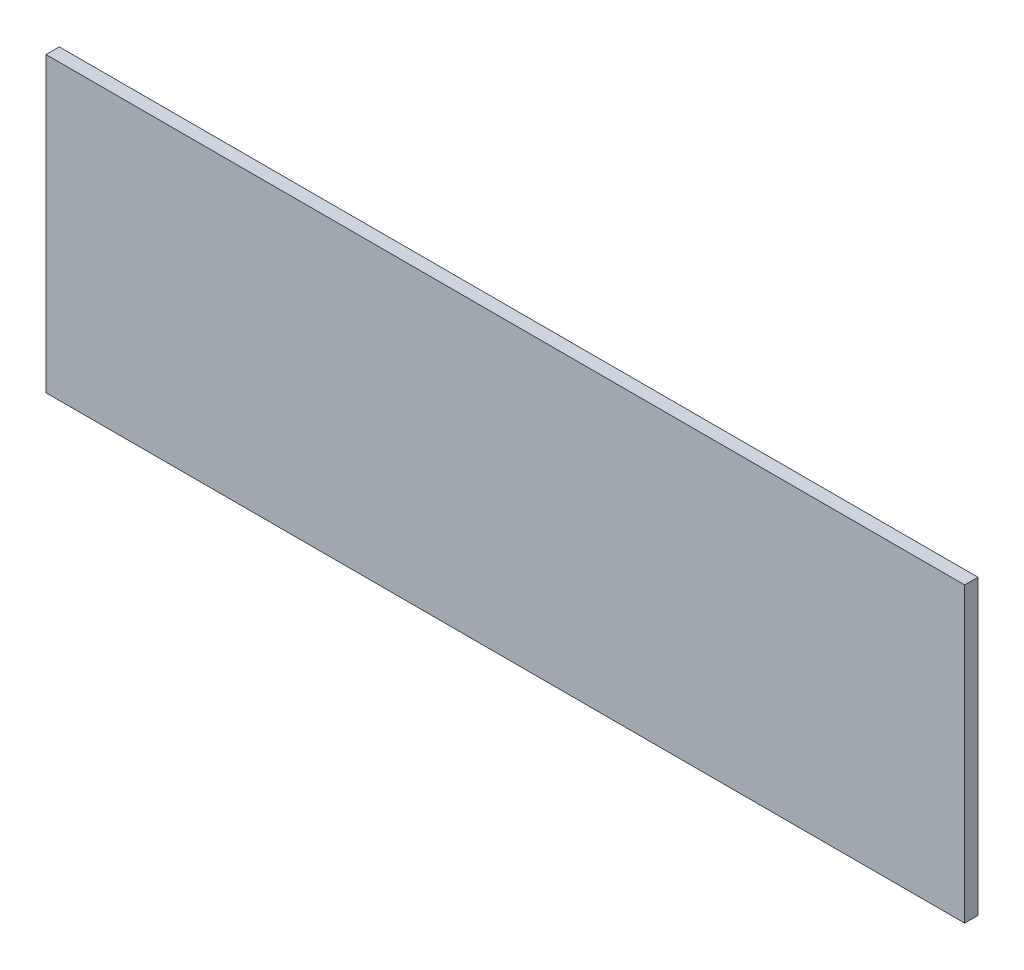
ISO-10303-21;
HEADER;
FILE_DESCRIPTION(('STEP AP214'),'2;1');
FILE_NAME('part.step','',(''),(''),'','','');
FILE_SCHEMA(('AUTOMOTIVE_DESIGN { 1 0 10303 214 1 1 1 1 }'));
ENDSEC;
DATA;
#1=APPLICATION_CONTEXT('core data for automotive mechanical design processes');
#2=APPLICATION_PROTOCOL_DEFINITION('international standard','automotive_design',2000,#1);
#3=PRODUCT_CONTEXT('',#1,'mechanical');
#4=PRODUCT('Part','Part','',(#3));
#5=PRODUCT_RELATED_PRODUCT_CATEGORY('part','',(#4));
#6=PRODUCT_DEFINITION_FORMATION('','',#4);
#7=PRODUCT_DEFINITION_CONTEXT('part definition',#1,'design');
#8=PRODUCT_DEFINITION('design','',#6,#7);
#9=PRODUCT_DEFINITION_SHAPE('','',#8);
#10=(LENGTH_UNIT() NAMED_UNIT(*) SI_UNIT(.MILLI.,.METRE.));
#11=(NAMED_UNIT(*) PLANE_ANGLE_UNIT() SI_UNIT($,.RADIAN.));
#12=(NAMED_UNIT(*) SI_UNIT($,.STERADIAN.) SOLID_ANGLE_UNIT());
#13=UNCERTAINTY_MEASURE_WITH_UNIT(LENGTH_MEASURE(1.E-05),#10,'distance_accuracy_value','');
#14=(GEOMETRIC_REPRESENTATION_CONTEXT(3) GLOBAL_UNCERTAINTY_ASSIGNED_CONTEXT((#13)) GLOBAL_UNIT_ASSIGNED_CONTEXT((#10,
#11,#12)) REPRESENTATION_CONTEXT('',''));
#15=CARTESIAN_POINT('',(0.,0.,0.));
#16=DIRECTION('',(0.,0.,1.));
#17=DIRECTION('',(1.,0.,0.));
#18=AXIS2_PLACEMENT_3D('',#15,#16,#17);
#19=CARTESIAN_POINT('',(0.,0.,5.));
#20=DIRECTION('',(0.,-1.,0.));
#21=DIRECTION('',(0.,0.,-1.));
#22=AXIS2_PLACEMENT_3D('',#19,#20,#21);
#23=PLANE('',#22);
#24=DIRECTION('',(-1.,0.,0.));
#25=VECTOR('',#24,1.);
#26=CARTESIAN_POINT('',(0.,0.,0.));
#27=LINE('',#26,#25);
#28=CARTESIAN_POINT('',(0.,0.,0.));
#29=VERTEX_POINT('',#28);
#30=CARTESIAN_POINT('',(-345.,0.,0.));
#31=VERTEX_POINT('',#30);
#32=EDGE_CURVE('E116',#29,#31,#27,.T.);
#33=ORIENTED_EDGE('',*,*,#32,.F.);
#34=DIRECTION('',(0.,0.,-1.));
#35=VECTOR('',#34,1.);
#36=CARTESIAN_POINT('',(0.,0.,5.));
#37=LINE('',#36,#35);
#38=CARTESIAN_POINT('',(0.,0.,5.));
#39=VERTEX_POINT('',#38);
#40=EDGE_CURVE('E11',#39,#29,#37,.T.);
#41=ORIENTED_EDGE('',*,*,#40,.F.);
#42=DIRECTION('',(-1.,0.,0.));
#43=VECTOR('',#42,1.);
#44=CARTESIAN_POINT('',(0.,0.,5.));
#45=LINE('',#44,#43);
#46=CARTESIAN_POINT('',(-345.,0.,5.));
#47=VERTEX_POINT('',#46);
#48=EDGE_CURVE('E108',#39,#47,#45,.T.);
#49=ORIENTED_EDGE('',*,*,#48,.T.);
#50=DIRECTION('',(0.,0.,-1.));
#51=VECTOR('',#50,1.);
#52=CARTESIAN_POINT('',(-345.,0.,5.));
#53=LINE('',#52,#51);
#54=EDGE_CURVE('E48',#47,#31,#53,.T.);
#55=ORIENTED_EDGE('',*,*,#54,.T.);
#56=EDGE_LOOP('',(#33,#41,#49,#55));
#57=FACE_BOUND('',#56,.T.);
#58=ADVANCED_FACE('F44',(#57),#23,.T.);
#59=CARTESIAN_POINT('',(0.,0.,5.));
#60=DIRECTION('',(-1.,0.,0.));
#61=DIRECTION('',(0.,0.,1.));
#62=AXIS2_PLACEMENT_3D('',#59,#60,#61);
#63=PLANE('',#62);
#64=DIRECTION('',(0.,1.,0.));
#65=VECTOR('',#64,1.);
#66=CARTESIAN_POINT('',(0.,0.,0.));
#67=LINE('',#66,#65);
#68=CARTESIAN_POINT('',(0.,110.,0.));
#69=VERTEX_POINT('',#68);
#70=EDGE_CURVE('E80',#29,#69,#67,.T.);
#71=ORIENTED_EDGE('',*,*,#70,.T.);
#72=DIRECTION('',(0.,0.,-1.));
#73=VECTOR('',#72,1.);
#74=CARTESIAN_POINT('',(0.,110.,5.));
#75=LINE('',#74,#73);
#76=CARTESIAN_POINT('',(0.,110.,5.));
#77=VERTEX_POINT('',#76);
#78=EDGE_CURVE('E54',#77,#69,#75,.T.);
#79=ORIENTED_EDGE('',*,*,#78,.F.);
#80=DIRECTION('',(0.,1.,0.));
#81=VECTOR('',#80,1.);
#82=CARTESIAN_POINT('',(0.,0.,5.));
#83=LINE('',#82,#81);
#84=EDGE_CURVE('E96',#39,#77,#83,.T.);
#85=ORIENTED_EDGE('',*,*,#84,.F.);
#86=ORIENTED_EDGE('',*,*,#40,.T.);
#87=EDGE_LOOP('',(#71,#79,#85,#86));
#88=FACE_BOUND('',#87,.T.);
#89=ADVANCED_FACE('F135',(#88),#63,.F.);
#90=CARTESIAN_POINT('',(0.,110.,5.));
#91=DIRECTION('',(0.,-1.,0.));
#92=DIRECTION('',(0.,0.,-1.));
#93=AXIS2_PLACEMENT_3D('',#90,#91,#92);
#94=PLANE('',#93);
#95=DIRECTION('',(-1.,0.,0.));
#96=VECTOR('',#95,1.);
#97=CARTESIAN_POINT('',(0.,110.,0.));
#98=LINE('',#97,#96);
#99=CARTESIAN_POINT('',(-345.,110.,0.));
#100=VERTEX_POINT('',#99);
#101=EDGE_CURVE('E101',#69,#100,#98,.T.);
#102=ORIENTED_EDGE('',*,*,#101,.T.);
#103=DIRECTION('',(0.,0.,-1.));
#104=VECTOR('',#103,1.);
#105=CARTESIAN_POINT('',(-345.,110.,5.));
#106=LINE('',#105,#104);
#107=CARTESIAN_POINT('',(-345.,110.,5.));
#108=VERTEX_POINT('',#107);
#109=EDGE_CURVE('E102',#108,#100,#106,.T.);
#110=ORIENTED_EDGE('',*,*,#109,.F.);
#111=DIRECTION('',(-1.,0.,0.));
#112=VECTOR('',#111,1.);
#113=CARTESIAN_POINT('',(0.,110.,5.));
#114=LINE('',#113,#112);
#115=EDGE_CURVE('E91',#77,#108,#114,.T.);
#116=ORIENTED_EDGE('',*,*,#115,.F.);
#117=ORIENTED_EDGE('',*,*,#78,.T.);
#118=EDGE_LOOP('',(#102,#110,#116,#117));
#119=FACE_BOUND('',#118,.T.);
#120=ADVANCED_FACE('F105',(#119),#94,.F.);
#121=CARTESIAN_POINT('',(-345.,0.,5.));
#122=DIRECTION('',(-1.,0.,0.));
#123=DIRECTION('',(0.,0.,1.));
#124=AXIS2_PLACEMENT_3D('',#121,#122,#123);
#125=PLANE('',#124);
#126=DIRECTION('',(0.,1.,0.));
#127=VECTOR('',#126,1.);
#128=CARTESIAN_POINT('',(-345.,0.,0.));
#129=LINE('',#128,#127);
#130=EDGE_CURVE('E120',#31,#100,#129,.T.);
#131=ORIENTED_EDGE('',*,*,#130,.F.);
#132=ORIENTED_EDGE('',*,*,#54,.F.);
#133=DIRECTION('',(0.,1.,0.));
#134=VECTOR('',#133,1.);
#135=CARTESIAN_POINT('',(-345.,0.,5.));
#136=LINE('',#135,#134);
#137=EDGE_CURVE('E94',#47,#108,#136,.T.);
#138=ORIENTED_EDGE('',*,*,#137,.T.);
#139=ORIENTED_EDGE('',*,*,#109,.T.);
#140=EDGE_LOOP('',(#131,#132,#138,#139));
#141=FACE_BOUND('',#140,.T.);
#142=ADVANCED_FACE('F107',(#141),#125,.T.);
#143=CARTESIAN_POINT('',(0.,0.,5.));
#144=DIRECTION('',(0.,0.,-1.));
#145=DIRECTION('',(-1.,0.,0.));
#146=AXIS2_PLACEMENT_3D('',#143,#144,#145);
#147=PLANE('',#146);
#148=ORIENTED_EDGE('',*,*,#48,.F.);
#149=ORIENTED_EDGE('',*,*,#84,.T.);
#150=ORIENTED_EDGE('',*,*,#115,.T.);
#151=ORIENTED_EDGE('',*,*,#137,.F.);
#152=EDGE_LOOP('',(#148,#149,#150,#151));
#153=FACE_BOUND('',#152,.T.);
#154=ADVANCED_FACE('F92',(#153),#147,.F.);
#155=CARTESIAN_POINT('',(0.,0.,0.));
#156=DIRECTION('',(0.,0.,-1.));
#157=DIRECTION('',(-1.,0.,0.));
#158=AXIS2_PLACEMENT_3D('',#155,#156,#157);
#159=PLANE('',#158);
#160=ORIENTED_EDGE('',*,*,#32,.T.);
#161=ORIENTED_EDGE('',*,*,#130,.T.);
#162=ORIENTED_EDGE('',*,*,#101,.F.);
#163=ORIENTED_EDGE('',*,*,#70,.F.);
#164=EDGE_LOOP('',(#160,#161,#162,#163));
#165=FACE_BOUND('',#164,.T.);
#166=ADVANCED_FACE('F129',(#165),#159,.T.);
#167=CLOSED_SHELL('',(#58,#89,#120,#142,#154,#166));
#168=MANIFOLD_SOLID_BREP('B2',#167);
#169=ADVANCED_BREP_SHAPE_REPRESENTATION('',(#18,#168),#14);
#170=SHAPE_DEFINITION_REPRESENTATION(#9,#169);
ENDSEC;
END-ISO-10303-21;
